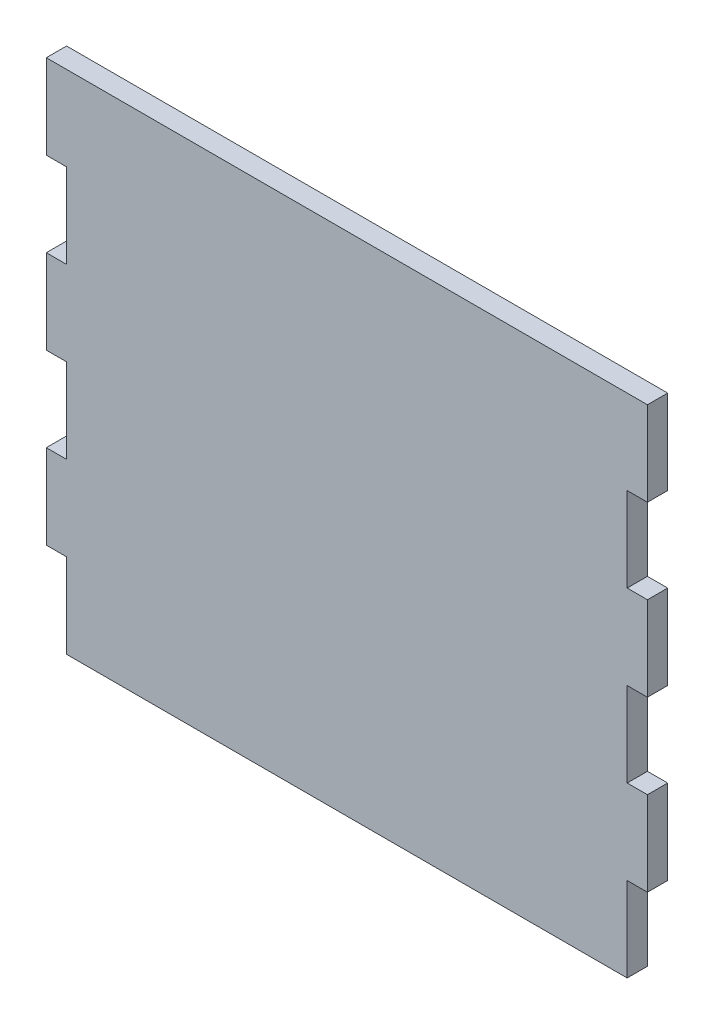
ISO-10303-21;
HEADER;
FILE_DESCRIPTION(('STEP AP214'),'2;1');
FILE_NAME('part.step','',(''),(''),'','','');
FILE_SCHEMA(('AUTOMOTIVE_DESIGN { 1 0 10303 214 1 1 1 1 }'));
ENDSEC;
DATA;
#1=APPLICATION_CONTEXT('core data for automotive mechanical design processes');
#2=APPLICATION_PROTOCOL_DEFINITION('international standard','automotive_design',2000,#1);
#3=PRODUCT_CONTEXT('',#1,'mechanical');
#4=PRODUCT('Part','Part','',(#3));
#5=PRODUCT_RELATED_PRODUCT_CATEGORY('part','',(#4));
#6=PRODUCT_DEFINITION_FORMATION('','',#4);
#7=PRODUCT_DEFINITION_CONTEXT('part definition',#1,'design');
#8=PRODUCT_DEFINITION('design','',#6,#7);
#9=PRODUCT_DEFINITION_SHAPE('','',#8);
#10=(LENGTH_UNIT() NAMED_UNIT(*) SI_UNIT(.MILLI.,.METRE.));
#11=(NAMED_UNIT(*) PLANE_ANGLE_UNIT() SI_UNIT($,.RADIAN.));
#12=(NAMED_UNIT(*) SI_UNIT($,.STERADIAN.) SOLID_ANGLE_UNIT());
#13=UNCERTAINTY_MEASURE_WITH_UNIT(LENGTH_MEASURE(1.E-05),#10,'distance_accuracy_value','');
#14=(GEOMETRIC_REPRESENTATION_CONTEXT(3) GLOBAL_UNCERTAINTY_ASSIGNED_CONTEXT((#13)) GLOBAL_UNIT_ASSIGNED_CONTEXT((#10,
#11,#12)) REPRESENTATION_CONTEXT('',''));
#15=CARTESIAN_POINT('',(0.,0.,0.));
#16=DIRECTION('',(0.,0.,1.));
#17=DIRECTION('',(1.,0.,0.));
#18=AXIS2_PLACEMENT_3D('',#15,#16,#17);
#19=CARTESIAN_POINT('',(0.,0.,6.));
#20=DIRECTION('',(-1.,0.,0.));
#21=DIRECTION('',(0.,0.,1.));
#22=AXIS2_PLACEMENT_3D('',#19,#20,#21);
#23=PLANE('',#22);
#24=DIRECTION('',(0.,1.,0.));
#25=VECTOR('',#24,1.);
#26=CARTESIAN_POINT('',(0.,0.,6.));
#27=LINE('',#26,#25);
#28=CARTESIAN_POINT('',(0.,125.,6.));
#29=VERTEX_POINT('',#28);
#30=CARTESIAN_POINT('',(0.,150.,6.));
#31=VERTEX_POINT('',#30);
#32=EDGE_CURVE('E409',#29,#31,#27,.T.);
#33=ORIENTED_EDGE('',*,*,#32,.F.);
#34=DIRECTION('',(0.,0.,1.));
#35=VECTOR('',#34,1.);
#36=CARTESIAN_POINT('',(0.,125.,0.));
#37=LINE('',#36,#35);
#38=CARTESIAN_POINT('',(0.,125.,0.));
#39=VERTEX_POINT('',#38);
#40=EDGE_CURVE('E251',#39,#29,#37,.T.);
#41=ORIENTED_EDGE('',*,*,#40,.F.);
#42=DIRECTION('',(0.,1.,0.));
#43=VECTOR('',#42,1.);
#44=CARTESIAN_POINT('',(0.,0.,0.));
#45=LINE('',#44,#43);
#46=CARTESIAN_POINT('',(0.,150.,0.));
#47=VERTEX_POINT('',#46);
#48=EDGE_CURVE('E400',#39,#47,#45,.T.);
#49=ORIENTED_EDGE('',*,*,#48,.T.);
#50=DIRECTION('',(0.,0.,-1.));
#51=VECTOR('',#50,1.);
#52=CARTESIAN_POINT('',(0.,150.,6.));
#53=LINE('',#52,#51);
#54=EDGE_CURVE('E11',#31,#47,#53,.T.);
#55=ORIENTED_EDGE('',*,*,#54,.F.);
#56=EDGE_LOOP('',(#33,#41,#49,#55));
#57=FACE_BOUND('',#56,.T.);
#58=ADVANCED_FACE('F45',(#57),#23,.F.);
#59=CARTESIAN_POINT('',(0.,75.,0.));
#60=VERTEX_POINT('',#59);
#61=CARTESIAN_POINT('',(0.,100.,0.));
#62=VERTEX_POINT('',#61);
#63=EDGE_CURVE('E430',#60,#62,#45,.T.);
#64=ORIENTED_EDGE('',*,*,#63,.T.);
#65=DIRECTION('',(0.,0.,1.));
#66=VECTOR('',#65,1.);
#67=CARTESIAN_POINT('',(0.,100.,0.));
#68=LINE('',#67,#66);
#69=CARTESIAN_POINT('',(0.,100.,6.));
#70=VERTEX_POINT('',#69);
#71=EDGE_CURVE('E218',#62,#70,#68,.T.);
#72=ORIENTED_EDGE('',*,*,#71,.T.);
#73=CARTESIAN_POINT('',(0.,75.,6.));
#74=VERTEX_POINT('',#73);
#75=EDGE_CURVE('E412',#74,#70,#27,.T.);
#76=ORIENTED_EDGE('',*,*,#75,.F.);
#77=DIRECTION('',(0.,0.,1.));
#78=VECTOR('',#77,1.);
#79=CARTESIAN_POINT('',(0.,75.,0.));
#80=LINE('',#79,#78);
#81=EDGE_CURVE('E317',#60,#74,#80,.T.);
#82=ORIENTED_EDGE('',*,*,#81,.F.);
#83=EDGE_LOOP('',(#64,#72,#76,#82));
#84=FACE_BOUND('',#83,.T.);
#85=ADVANCED_FACE('F472',(#84),#23,.F.);
#86=CARTESIAN_POINT('',(-178.,0.,6.));
#87=DIRECTION('',(1.,0.,0.));
#88=DIRECTION('',(0.,0.,-1.));
#89=AXIS2_PLACEMENT_3D('',#86,#87,#88);
#90=PLANE('',#89);
#91=DIRECTION('',(0.,-1.,0.));
#92=VECTOR('',#91,1.);
#93=CARTESIAN_POINT('',(-178.,0.,0.));
#94=LINE('',#93,#92);
#95=CARTESIAN_POINT('',(-178.,100.,0.));
#96=VERTEX_POINT('',#95);
#97=CARTESIAN_POINT('',(-178.,75.,0.));
#98=VERTEX_POINT('',#97);
#99=EDGE_CURVE('E440',#96,#98,#94,.T.);
#100=ORIENTED_EDGE('',*,*,#99,.T.);
#101=DIRECTION('',(0.,0.,1.));
#102=VECTOR('',#101,1.);
#103=CARTESIAN_POINT('',(-178.,75.,0.));
#104=LINE('',#103,#102);
#105=CARTESIAN_POINT('',(-178.,75.,6.));
#106=VERTEX_POINT('',#105);
#107=EDGE_CURVE('E244',#98,#106,#104,.T.);
#108=ORIENTED_EDGE('',*,*,#107,.T.);
#109=DIRECTION('',(0.,-1.,0.));
#110=VECTOR('',#109,1.);
#111=CARTESIAN_POINT('',(-178.,0.,6.));
#112=LINE('',#111,#110);
#113=CARTESIAN_POINT('',(-178.,100.,6.));
#114=VERTEX_POINT('',#113);
#115=EDGE_CURVE('E424',#114,#106,#112,.T.);
#116=ORIENTED_EDGE('',*,*,#115,.F.);
#117=DIRECTION('',(0.,0.,1.));
#118=VECTOR('',#117,1.);
#119=CARTESIAN_POINT('',(-178.,100.,0.));
#120=LINE('',#119,#118);
#121=EDGE_CURVE('E386',#96,#114,#120,.T.);
#122=ORIENTED_EDGE('',*,*,#121,.F.);
#123=EDGE_LOOP('',(#100,#108,#116,#122));
#124=FACE_BOUND('',#123,.T.);
#125=ADVANCED_FACE('F530',(#124),#90,.F.);
#126=CARTESIAN_POINT('',(-178.,150.,0.));
#127=VERTEX_POINT('',#126);
#128=CARTESIAN_POINT('',(-178.,125.,0.));
#129=VERTEX_POINT('',#128);
#130=EDGE_CURVE('E436',#127,#129,#94,.T.);
#131=ORIENTED_EDGE('',*,*,#130,.T.);
#132=DIRECTION('',(0.,0.,1.));
#133=VECTOR('',#132,1.);
#134=CARTESIAN_POINT('',(-178.,125.,0.));
#135=LINE('',#134,#133);
#136=CARTESIAN_POINT('',(-178.,125.,6.));
#137=VERTEX_POINT('',#136);
#138=EDGE_CURVE('E396',#129,#137,#135,.T.);
#139=ORIENTED_EDGE('',*,*,#138,.T.);
#140=CARTESIAN_POINT('',(-178.,150.,6.));
#141=VERTEX_POINT('',#140);
#142=EDGE_CURVE('E419',#141,#137,#112,.T.);
#143=ORIENTED_EDGE('',*,*,#142,.F.);
#144=DIRECTION('',(0.,0.,-1.));
#145=VECTOR('',#144,1.);
#146=CARTESIAN_POINT('',(-178.,150.,6.));
#147=LINE('',#146,#145);
#148=EDGE_CURVE('E54',#141,#127,#147,.T.);
#149=ORIENTED_EDGE('',*,*,#148,.T.);
#150=EDGE_LOOP('',(#131,#139,#143,#149));
#151=FACE_BOUND('',#150,.T.);
#152=ADVANCED_FACE('F449',(#151),#90,.F.);
#153=CARTESIAN_POINT('',(0.,25.,0.));
#154=VERTEX_POINT('',#153);
#155=CARTESIAN_POINT('',(0.,50.,0.));
#156=VERTEX_POINT('',#155);
#157=EDGE_CURVE('E431',#154,#156,#45,.T.);
#158=ORIENTED_EDGE('',*,*,#157,.T.);
#159=DIRECTION('',(0.,0.,1.));
#160=VECTOR('',#159,1.);
#161=CARTESIAN_POINT('',(0.,50.,0.));
#162=LINE('',#161,#160);
#163=CARTESIAN_POINT('',(0.,50.,6.));
#164=VERTEX_POINT('',#163);
#165=EDGE_CURVE('E320',#156,#164,#162,.T.);
#166=ORIENTED_EDGE('',*,*,#165,.T.);
#167=CARTESIAN_POINT('',(0.,25.,6.));
#168=VERTEX_POINT('',#167);
#169=EDGE_CURVE('E414',#168,#164,#27,.T.);
#170=ORIENTED_EDGE('',*,*,#169,.F.);
#171=DIRECTION('',(0.,0.,1.));
#172=VECTOR('',#171,1.);
#173=CARTESIAN_POINT('',(0.,25.,0.));
#174=LINE('',#173,#172);
#175=EDGE_CURVE('E367',#154,#168,#174,.T.);
#176=ORIENTED_EDGE('',*,*,#175,.F.);
#177=EDGE_LOOP('',(#158,#166,#170,#176));
#178=FACE_BOUND('',#177,.T.);
#179=ADVANCED_FACE('F47',(#178),#23,.F.);
#180=CARTESIAN_POINT('',(0.,150.,6.));
#181=DIRECTION('',(0.,-1.,0.));
#182=DIRECTION('',(0.,0.,-1.));
#183=AXIS2_PLACEMENT_3D('',#180,#181,#182);
#184=PLANE('',#183);
#185=DIRECTION('',(-1.,0.,0.));
#186=VECTOR('',#185,1.);
#187=CARTESIAN_POINT('',(0.,150.,0.));
#188=LINE('',#187,#186);
#189=EDGE_CURVE('E432',#47,#127,#188,.T.);
#190=ORIENTED_EDGE('',*,*,#189,.T.);
#191=ORIENTED_EDGE('',*,*,#148,.F.);
#192=DIRECTION('',(-1.,0.,0.));
#193=VECTOR('',#192,1.);
#194=CARTESIAN_POINT('',(0.,150.,6.));
#195=LINE('',#194,#193);
#196=EDGE_CURVE('E415',#31,#141,#195,.T.);
#197=ORIENTED_EDGE('',*,*,#196,.F.);
#198=ORIENTED_EDGE('',*,*,#54,.T.);
#199=EDGE_LOOP('',(#190,#191,#197,#198));
#200=FACE_BOUND('',#199,.T.);
#201=ADVANCED_FACE('F463',(#200),#184,.F.);
#202=CARTESIAN_POINT('',(-178.,50.,6.));
#203=VERTEX_POINT('',#202);
#204=CARTESIAN_POINT('',(-178.,25.,6.));
#205=VERTEX_POINT('',#204);
#206=EDGE_CURVE('E418',#203,#205,#112,.T.);
#207=ORIENTED_EDGE('',*,*,#206,.F.);
#208=DIRECTION('',(0.,0.,1.));
#209=VECTOR('',#208,1.);
#210=CARTESIAN_POINT('',(-178.,50.,0.));
#211=LINE('',#210,#209);
#212=CARTESIAN_POINT('',(-178.,50.,0.));
#213=VERTEX_POINT('',#212);
#214=EDGE_CURVE('E267',#213,#203,#211,.T.);
#215=ORIENTED_EDGE('',*,*,#214,.F.);
#216=CARTESIAN_POINT('',(-178.,25.,0.));
#217=VERTEX_POINT('',#216);
#218=EDGE_CURVE('E435',#213,#217,#94,.T.);
#219=ORIENTED_EDGE('',*,*,#218,.T.);
#220=DIRECTION('',(0.,0.,1.));
#221=VECTOR('',#220,1.);
#222=CARTESIAN_POINT('',(-178.,25.,0.));
#223=LINE('',#222,#221);
#224=EDGE_CURVE('E309',#217,#205,#223,.T.);
#225=ORIENTED_EDGE('',*,*,#224,.T.);
#226=EDGE_LOOP('',(#207,#215,#219,#225));
#227=FACE_BOUND('',#226,.T.);
#228=ADVANCED_FACE('F500',(#227),#90,.F.);
#229=CARTESIAN_POINT('',(0.,0.,6.));
#230=DIRECTION('',(0.,1.,0.));
#231=DIRECTION('',(-1.,0.,0.));
#232=AXIS2_PLACEMENT_3D('',#229,#230,#231);
#233=PLANE('',#232);
#234=DIRECTION('',(1.,0.,0.));
#235=VECTOR('',#234,1.);
#236=CARTESIAN_POINT('',(0.,0.,6.));
#237=LINE('',#236,#235);
#238=CARTESIAN_POINT('',(-172.,0.,6.));
#239=VERTEX_POINT('',#238);
#240=CARTESIAN_POINT('',(-6.00000000000001,0.,6.));
#241=VERTEX_POINT('',#240);
#242=EDGE_CURVE('E423',#239,#241,#237,.T.);
#243=ORIENTED_EDGE('',*,*,#242,.F.);
#244=DIRECTION('',(0.,0.,1.));
#245=VECTOR('',#244,1.);
#246=CARTESIAN_POINT('',(-172.,0.,0.));
#247=LINE('',#246,#245);
#248=CARTESIAN_POINT('',(-172.,0.,0.));
#249=VERTEX_POINT('',#248);
#250=EDGE_CURVE('E333',#249,#239,#247,.T.);
#251=ORIENTED_EDGE('',*,*,#250,.F.);
#252=DIRECTION('',(1.,0.,0.));
#253=VECTOR('',#252,1.);
#254=CARTESIAN_POINT('',(0.,0.,0.));
#255=LINE('',#254,#253);
#256=CARTESIAN_POINT('',(-6.00000000000001,0.,0.));
#257=VERTEX_POINT('',#256);
#258=EDGE_CURVE('E413',#249,#257,#255,.T.);
#259=ORIENTED_EDGE('',*,*,#258,.T.);
#260=DIRECTION('',(0.,0.,1.));
#261=VECTOR('',#260,1.);
#262=CARTESIAN_POINT('',(-6.00000000000001,0.,0.));
#263=LINE('',#262,#261);
#264=EDGE_CURVE('E358',#257,#241,#263,.T.);
#265=ORIENTED_EDGE('',*,*,#264,.T.);
#266=EDGE_LOOP('',(#243,#251,#259,#265));
#267=FACE_BOUND('',#266,.T.);
#268=ADVANCED_FACE('F509',(#267),#233,.F.);
#269=CARTESIAN_POINT('',(0.,0.,6.));
#270=DIRECTION('',(0.,0.,1.));
#271=DIRECTION('',(1.,0.,0.));
#272=AXIS2_PLACEMENT_3D('',#269,#270,#271);
#273=PLANE('',#272);
#274=DIRECTION('',(-1.,0.,0.));
#275=VECTOR('',#274,1.);
#276=CARTESIAN_POINT('',(-6.00000000000001,125.,6.));
#277=LINE('',#276,#275);
#278=CARTESIAN_POINT('',(-6.00000000000001,125.,6.));
#279=VERTEX_POINT('',#278);
#280=EDGE_CURVE('E233',#29,#279,#277,.T.);
#281=ORIENTED_EDGE('',*,*,#280,.F.);
#282=ORIENTED_EDGE('',*,*,#32,.T.);
#283=ORIENTED_EDGE('',*,*,#196,.T.);
#284=ORIENTED_EDGE('',*,*,#142,.T.);
#285=DIRECTION('',(-1.,0.,0.));
#286=VECTOR('',#285,1.);
#287=CARTESIAN_POINT('',(-178.,125.,6.));
#288=LINE('',#287,#286);
#289=CARTESIAN_POINT('',(-172.,125.,6.));
#290=VERTEX_POINT('',#289);
#291=EDGE_CURVE('E378',#290,#137,#288,.T.);
#292=ORIENTED_EDGE('',*,*,#291,.F.);
#293=DIRECTION('',(0.,1.,0.));
#294=VECTOR('',#293,1.);
#295=CARTESIAN_POINT('',(-172.,125.,6.));
#296=LINE('',#295,#294);
#297=CARTESIAN_POINT('',(-172.,100.,6.));
#298=VERTEX_POINT('',#297);
#299=EDGE_CURVE('E390',#298,#290,#296,.T.);
#300=ORIENTED_EDGE('',*,*,#299,.F.);
#301=DIRECTION('',(1.,0.,0.));
#302=VECTOR('',#301,1.);
#303=CARTESIAN_POINT('',(-178.,100.,6.));
#304=LINE('',#303,#302);
#305=EDGE_CURVE('E250',#114,#298,#304,.T.);
#306=ORIENTED_EDGE('',*,*,#305,.F.);
#307=ORIENTED_EDGE('',*,*,#115,.T.);
#308=DIRECTION('',(-1.,0.,0.));
#309=VECTOR('',#308,1.);
#310=CARTESIAN_POINT('',(-178.,75.,6.));
#311=LINE('',#310,#309);
#312=CARTESIAN_POINT('',(-172.,75.,6.));
#313=VERTEX_POINT('',#312);
#314=EDGE_CURVE('E260',#313,#106,#311,.T.);
#315=ORIENTED_EDGE('',*,*,#314,.F.);
#316=DIRECTION('',(0.,1.,0.));
#317=VECTOR('',#316,1.);
#318=CARTESIAN_POINT('',(-172.,75.,6.));
#319=LINE('',#318,#317);
#320=CARTESIAN_POINT('',(-172.,50.,6.));
#321=VERTEX_POINT('',#320);
#322=EDGE_CURVE('E272',#321,#313,#319,.T.);
#323=ORIENTED_EDGE('',*,*,#322,.F.);
#324=DIRECTION('',(1.,0.,0.));
#325=VECTOR('',#324,1.);
#326=CARTESIAN_POINT('',(-178.,50.,6.));
#327=LINE('',#326,#325);
#328=EDGE_CURVE('E268',#203,#321,#327,.T.);
#329=ORIENTED_EDGE('',*,*,#328,.F.);
#330=ORIENTED_EDGE('',*,*,#206,.T.);
#331=DIRECTION('',(-1.,0.,0.));
#332=VECTOR('',#331,1.);
#333=CARTESIAN_POINT('',(-178.,25.,6.));
#334=LINE('',#333,#332);
#335=CARTESIAN_POINT('',(-172.,25.,6.));
#336=VERTEX_POINT('',#335);
#337=EDGE_CURVE('E330',#336,#205,#334,.T.);
#338=ORIENTED_EDGE('',*,*,#337,.F.);
#339=DIRECTION('',(0.,1.,0.));
#340=VECTOR('',#339,1.);
#341=CARTESIAN_POINT('',(-172.,25.,6.));
#342=LINE('',#341,#340);
#343=EDGE_CURVE('E334',#239,#336,#342,.T.);
#344=ORIENTED_EDGE('',*,*,#343,.F.);
#345=ORIENTED_EDGE('',*,*,#242,.T.);
#346=DIRECTION('',(0.,-1.,0.));
#347=VECTOR('',#346,1.);
#348=CARTESIAN_POINT('',(-6.00000000000001,25.,6.));
#349=LINE('',#348,#347);
#350=CARTESIAN_POINT('',(-6.00000000000001,25.,6.));
#351=VERTEX_POINT('',#350);
#352=EDGE_CURVE('E359',#351,#241,#349,.T.);
#353=ORIENTED_EDGE('',*,*,#352,.F.);
#354=DIRECTION('',(-1.,0.,0.));
#355=VECTOR('',#354,1.);
#356=CARTESIAN_POINT('',(-6.00000000000001,25.,6.));
#357=LINE('',#356,#355);
#358=EDGE_CURVE('E354',#168,#351,#357,.T.);
#359=ORIENTED_EDGE('',*,*,#358,.F.);
#360=ORIENTED_EDGE('',*,*,#169,.T.);
#361=DIRECTION('',(1.,0.,0.));
#362=VECTOR('',#361,1.);
#363=CARTESIAN_POINT('',(-6.00000000000001,50.,6.));
#364=LINE('',#363,#362);
#365=CARTESIAN_POINT('',(-6.00000000000001,50.,6.));
#366=VERTEX_POINT('',#365);
#367=EDGE_CURVE('E308',#366,#164,#364,.T.);
#368=ORIENTED_EDGE('',*,*,#367,.F.);
#369=DIRECTION('',(0.,-1.,0.));
#370=VECTOR('',#369,1.);
#371=CARTESIAN_POINT('',(-6.00000000000001,75.,6.));
#372=LINE('',#371,#370);
#373=CARTESIAN_POINT('',(-6.00000000000001,75.,6.));
#374=VERTEX_POINT('',#373);
#375=EDGE_CURVE('E304',#374,#366,#372,.T.);
#376=ORIENTED_EDGE('',*,*,#375,.F.);
#377=DIRECTION('',(-1.,0.,0.));
#378=VECTOR('',#377,1.);
#379=CARTESIAN_POINT('',(-6.00000000000001,75.,6.));
#380=LINE('',#379,#378);
#381=EDGE_CURVE('E295',#74,#374,#380,.T.);
#382=ORIENTED_EDGE('',*,*,#381,.F.);
#383=ORIENTED_EDGE('',*,*,#75,.T.);
#384=DIRECTION('',(1.,0.,0.));
#385=VECTOR('',#384,1.);
#386=CARTESIAN_POINT('',(-6.00000000000001,100.,6.));
#387=LINE('',#386,#385);
#388=CARTESIAN_POINT('',(-6.00000000000001,100.,6.));
#389=VERTEX_POINT('',#388);
#390=EDGE_CURVE('E237',#389,#70,#387,.T.);
#391=ORIENTED_EDGE('',*,*,#390,.F.);
#392=DIRECTION('',(0.,-1.,0.));
#393=VECTOR('',#392,1.);
#394=CARTESIAN_POINT('',(-6.00000000000001,125.,6.));
#395=LINE('',#394,#393);
#396=EDGE_CURVE('E214',#279,#389,#395,.T.);
#397=ORIENTED_EDGE('',*,*,#396,.F.);
#398=EDGE_LOOP('',(#281,#282,#283,#284,#292,#300,#306,#307,#315,#323,#329,#330,#338,#344,#345,
#353,#359,#360,#368,#376,#382,#383,#391,#397));
#399=FACE_BOUND('',#398,.T.);
#400=ADVANCED_FACE('F459',(#399),#273,.T.);
#401=CARTESIAN_POINT('',(0.,0.,0.));
#402=DIRECTION('',(0.,0.,1.));
#403=DIRECTION('',(1.,0.,0.));
#404=AXIS2_PLACEMENT_3D('',#401,#402,#403);
#405=PLANE('',#404);
#406=ORIENTED_EDGE('',*,*,#48,.F.);
#407=DIRECTION('',(-1.,0.,0.));
#408=VECTOR('',#407,1.);
#409=CARTESIAN_POINT('',(-6.00000000000001,125.,0.));
#410=LINE('',#409,#408);
#411=CARTESIAN_POINT('',(-6.00000000000001,125.,0.));
#412=VERTEX_POINT('',#411);
#413=EDGE_CURVE('E219',#39,#412,#410,.T.);
#414=ORIENTED_EDGE('',*,*,#413,.T.);
#415=DIRECTION('',(0.,-1.,0.));
#416=VECTOR('',#415,1.);
#417=CARTESIAN_POINT('',(-6.00000000000001,125.,0.));
#418=LINE('',#417,#416);
#419=CARTESIAN_POINT('',(-6.00000000000001,100.,0.));
#420=VERTEX_POINT('',#419);
#421=EDGE_CURVE('E211',#412,#420,#418,.T.);
#422=ORIENTED_EDGE('',*,*,#421,.T.);
#423=DIRECTION('',(1.,0.,0.));
#424=VECTOR('',#423,1.);
#425=CARTESIAN_POINT('',(-6.00000000000001,100.,0.));
#426=LINE('',#425,#424);
#427=EDGE_CURVE('E222',#420,#62,#426,.T.);
#428=ORIENTED_EDGE('',*,*,#427,.T.);
#429=ORIENTED_EDGE('',*,*,#63,.F.);
#430=DIRECTION('',(-1.,0.,0.));
#431=VECTOR('',#430,1.);
#432=CARTESIAN_POINT('',(-6.00000000000001,75.,0.));
#433=LINE('',#432,#431);
#434=CARTESIAN_POINT('',(-6.00000000000001,75.,0.));
#435=VERTEX_POINT('',#434);
#436=EDGE_CURVE('E299',#60,#435,#433,.T.);
#437=ORIENTED_EDGE('',*,*,#436,.T.);
#438=DIRECTION('',(0.,-1.,0.));
#439=VECTOR('',#438,1.);
#440=CARTESIAN_POINT('',(-6.00000000000001,75.,0.));
#441=LINE('',#440,#439);
#442=CARTESIAN_POINT('',(-6.00000000000001,50.,0.));
#443=VERTEX_POINT('',#442);
#444=EDGE_CURVE('E290',#435,#443,#441,.T.);
#445=ORIENTED_EDGE('',*,*,#444,.T.);
#446=DIRECTION('',(1.,0.,0.));
#447=VECTOR('',#446,1.);
#448=CARTESIAN_POINT('',(-6.00000000000001,50.,0.));
#449=LINE('',#448,#447);
#450=EDGE_CURVE('E294',#443,#156,#449,.T.);
#451=ORIENTED_EDGE('',*,*,#450,.T.);
#452=ORIENTED_EDGE('',*,*,#157,.F.);
#453=DIRECTION('',(-1.,0.,0.));
#454=VECTOR('',#453,1.);
#455=CARTESIAN_POINT('',(-6.00000000000001,25.,0.));
#456=LINE('',#455,#454);
#457=CARTESIAN_POINT('',(-6.00000000000001,25.,0.));
#458=VERTEX_POINT('',#457);
#459=EDGE_CURVE('E353',#154,#458,#456,.T.);
#460=ORIENTED_EDGE('',*,*,#459,.T.);
#461=DIRECTION('',(0.,-1.,0.));
#462=VECTOR('',#461,1.);
#463=CARTESIAN_POINT('',(-6.00000000000001,25.,0.));
#464=LINE('',#463,#462);
#465=EDGE_CURVE('E349',#458,#257,#464,.T.);
#466=ORIENTED_EDGE('',*,*,#465,.T.);
#467=ORIENTED_EDGE('',*,*,#258,.F.);
#468=DIRECTION('',(0.,1.,0.));
#469=VECTOR('',#468,1.);
#470=CARTESIAN_POINT('',(-172.,25.,0.));
#471=LINE('',#470,#469);
#472=CARTESIAN_POINT('',(-172.,25.,0.));
#473=VERTEX_POINT('',#472);
#474=EDGE_CURVE('E326',#249,#473,#471,.T.);
#475=ORIENTED_EDGE('',*,*,#474,.T.);
#476=DIRECTION('',(-1.,0.,0.));
#477=VECTOR('',#476,1.);
#478=CARTESIAN_POINT('',(-178.,25.,0.));
#479=LINE('',#478,#477);
#480=EDGE_CURVE('E69',#473,#217,#479,.T.);
#481=ORIENTED_EDGE('',*,*,#480,.T.);
#482=ORIENTED_EDGE('',*,*,#218,.F.);
#483=DIRECTION('',(1.,0.,0.));
#484=VECTOR('',#483,1.);
#485=CARTESIAN_POINT('',(-178.,50.,0.));
#486=LINE('',#485,#484);
#487=CARTESIAN_POINT('',(-172.,50.,0.));
#488=VERTEX_POINT('',#487);
#489=EDGE_CURVE('E256',#213,#488,#486,.T.);
#490=ORIENTED_EDGE('',*,*,#489,.T.);
#491=DIRECTION('',(0.,1.,0.));
#492=VECTOR('',#491,1.);
#493=CARTESIAN_POINT('',(-172.,75.,0.));
#494=LINE('',#493,#492);
#495=CARTESIAN_POINT('',(-172.,75.,0.));
#496=VERTEX_POINT('',#495);
#497=EDGE_CURVE('E61',#488,#496,#494,.T.);
#498=ORIENTED_EDGE('',*,*,#497,.T.);
#499=DIRECTION('',(-1.,0.,0.));
#500=VECTOR('',#499,1.);
#501=CARTESIAN_POINT('',(-178.,75.,0.));
#502=LINE('',#501,#500);
#503=EDGE_CURVE('E263',#496,#98,#502,.T.);
#504=ORIENTED_EDGE('',*,*,#503,.T.);
#505=ORIENTED_EDGE('',*,*,#99,.F.);
#506=DIRECTION('',(1.,0.,0.));
#507=VECTOR('',#506,1.);
#508=CARTESIAN_POINT('',(-178.,100.,0.));
#509=LINE('',#508,#507);
#510=CARTESIAN_POINT('',(-172.,100.,0.));
#511=VERTEX_POINT('',#510);
#512=EDGE_CURVE('E373',#96,#511,#509,.T.);
#513=ORIENTED_EDGE('',*,*,#512,.T.);
#514=DIRECTION('',(0.,1.,0.));
#515=VECTOR('',#514,1.);
#516=CARTESIAN_POINT('',(-172.,125.,0.));
#517=LINE('',#516,#515);
#518=CARTESIAN_POINT('',(-172.,125.,0.));
#519=VERTEX_POINT('',#518);
#520=EDGE_CURVE('E377',#511,#519,#517,.T.);
#521=ORIENTED_EDGE('',*,*,#520,.T.);
#522=DIRECTION('',(-1.,0.,0.));
#523=VECTOR('',#522,1.);
#524=CARTESIAN_POINT('',(-178.,125.,0.));
#525=LINE('',#524,#523);
#526=EDGE_CURVE('E382',#519,#129,#525,.T.);
#527=ORIENTED_EDGE('',*,*,#526,.T.);
#528=ORIENTED_EDGE('',*,*,#130,.F.);
#529=ORIENTED_EDGE('',*,*,#189,.F.);
#530=EDGE_LOOP('',(#406,#414,#422,#428,#429,#437,#445,#451,#452,#460,#466,#467,#475,#481,#482,
#490,#498,#504,#505,#513,#521,#527,#528,#529));
#531=FACE_BOUND('',#530,.T.);
#532=ADVANCED_FACE('F231',(#531),#405,.F.);
#533=CARTESIAN_POINT('',(-178.,125.,0.));
#534=DIRECTION('',(0.,1.,0.));
#535=DIRECTION('',(0.,0.,1.));
#536=AXIS2_PLACEMENT_3D('',#533,#534,#535);
#537=PLANE('',#536);
#538=ORIENTED_EDGE('',*,*,#291,.T.);
#539=ORIENTED_EDGE('',*,*,#138,.F.);
#540=ORIENTED_EDGE('',*,*,#526,.F.);
#541=DIRECTION('',(0.,0.,1.));
#542=VECTOR('',#541,1.);
#543=CARTESIAN_POINT('',(-172.,125.,0.));
#544=LINE('',#543,#542);
#545=EDGE_CURVE('E401',#519,#290,#544,.T.);
#546=ORIENTED_EDGE('',*,*,#545,.T.);
#547=EDGE_LOOP('',(#538,#539,#540,#546));
#548=FACE_BOUND('',#547,.T.);
#549=ADVANCED_FACE('F455',(#548),#537,.F.);
#550=CARTESIAN_POINT('',(-172.,125.,0.));
#551=DIRECTION('',(1.,0.,0.));
#552=DIRECTION('',(0.,0.,-1.));
#553=AXIS2_PLACEMENT_3D('',#550,#551,#552);
#554=PLANE('',#553);
#555=ORIENTED_EDGE('',*,*,#299,.T.);
#556=ORIENTED_EDGE('',*,*,#545,.F.);
#557=ORIENTED_EDGE('',*,*,#520,.F.);
#558=DIRECTION('',(0.,0.,1.));
#559=VECTOR('',#558,1.);
#560=CARTESIAN_POINT('',(-172.,100.,0.));
#561=LINE('',#560,#559);
#562=EDGE_CURVE('E404',#511,#298,#561,.T.);
#563=ORIENTED_EDGE('',*,*,#562,.T.);
#564=EDGE_LOOP('',(#555,#556,#557,#563));
#565=FACE_BOUND('',#564,.T.);
#566=ADVANCED_FACE('F556',(#565),#554,.F.);
#567=CARTESIAN_POINT('',(-178.,100.,0.));
#568=DIRECTION('',(0.,-1.,0.));
#569=DIRECTION('',(0.,0.,-1.));
#570=AXIS2_PLACEMENT_3D('',#567,#568,#569);
#571=PLANE('',#570);
#572=ORIENTED_EDGE('',*,*,#305,.T.);
#573=ORIENTED_EDGE('',*,*,#562,.F.);
#574=ORIENTED_EDGE('',*,*,#512,.F.);
#575=ORIENTED_EDGE('',*,*,#121,.T.);
#576=EDGE_LOOP('',(#572,#573,#574,#575));
#577=FACE_BOUND('',#576,.T.);
#578=ADVANCED_FACE('F553',(#577),#571,.F.);
#579=CARTESIAN_POINT('',(-6.00000000000001,25.,0.));
#580=DIRECTION('',(-1.,0.,0.));
#581=DIRECTION('',(0.,0.,1.));
#582=AXIS2_PLACEMENT_3D('',#579,#580,#581);
#583=PLANE('',#582);
#584=ORIENTED_EDGE('',*,*,#352,.T.);
#585=ORIENTED_EDGE('',*,*,#264,.F.);
#586=ORIENTED_EDGE('',*,*,#465,.F.);
#587=DIRECTION('',(0.,0.,1.));
#588=VECTOR('',#587,1.);
#589=CARTESIAN_POINT('',(-6.00000000000001,25.,0.));
#590=LINE('',#589,#588);
#591=EDGE_CURVE('E338',#458,#351,#590,.T.);
#592=ORIENTED_EDGE('',*,*,#591,.T.);
#593=EDGE_LOOP('',(#584,#585,#586,#592));
#594=FACE_BOUND('',#593,.T.);
#595=ADVANCED_FACE('F522',(#594),#583,.F.);
#596=CARTESIAN_POINT('',(-6.00000000000001,25.,0.));
#597=DIRECTION('',(0.,1.,0.));
#598=DIRECTION('',(0.,0.,1.));
#599=AXIS2_PLACEMENT_3D('',#596,#597,#598);
#600=PLANE('',#599);
#601=ORIENTED_EDGE('',*,*,#358,.T.);
#602=ORIENTED_EDGE('',*,*,#591,.F.);
#603=ORIENTED_EDGE('',*,*,#459,.F.);
#604=ORIENTED_EDGE('',*,*,#175,.T.);
#605=EDGE_LOOP('',(#601,#602,#603,#604));
#606=FACE_BOUND('',#605,.T.);
#607=ADVANCED_FACE('F514',(#606),#600,.F.);
#608=CARTESIAN_POINT('',(-178.,25.,0.));
#609=DIRECTION('',(0.,1.,0.));
#610=DIRECTION('',(0.,0.,1.));
#611=AXIS2_PLACEMENT_3D('',#608,#609,#610);
#612=PLANE('',#611);
#613=ORIENTED_EDGE('',*,*,#337,.T.);
#614=ORIENTED_EDGE('',*,*,#224,.F.);
#615=ORIENTED_EDGE('',*,*,#480,.F.);
#616=DIRECTION('',(0.,0.,1.));
#617=VECTOR('',#616,1.);
#618=CARTESIAN_POINT('',(-172.,25.,0.));
#619=LINE('',#618,#617);
#620=EDGE_CURVE('E344',#473,#336,#619,.T.);
#621=ORIENTED_EDGE('',*,*,#620,.T.);
#622=EDGE_LOOP('',(#613,#614,#615,#621));
#623=FACE_BOUND('',#622,.T.);
#624=ADVANCED_FACE('F512',(#623),#612,.F.);
#625=CARTESIAN_POINT('',(-172.,25.,0.));
#626=DIRECTION('',(1.,0.,0.));
#627=DIRECTION('',(0.,0.,-1.));
#628=AXIS2_PLACEMENT_3D('',#625,#626,#627);
#629=PLANE('',#628);
#630=ORIENTED_EDGE('',*,*,#343,.T.);
#631=ORIENTED_EDGE('',*,*,#620,.F.);
#632=ORIENTED_EDGE('',*,*,#474,.F.);
#633=ORIENTED_EDGE('',*,*,#250,.T.);
#634=EDGE_LOOP('',(#630,#631,#632,#633));
#635=FACE_BOUND('',#634,.T.);
#636=ADVANCED_FACE('F505',(#635),#629,.F.);
#637=CARTESIAN_POINT('',(-6.00000000000001,75.,0.));
#638=DIRECTION('',(-1.,0.,0.));
#639=DIRECTION('',(0.,0.,1.));
#640=AXIS2_PLACEMENT_3D('',#637,#638,#639);
#641=PLANE('',#640);
#642=ORIENTED_EDGE('',*,*,#375,.T.);
#643=DIRECTION('',(0.,0.,1.));
#644=VECTOR('',#643,1.);
#645=CARTESIAN_POINT('',(-6.00000000000001,50.,0.));
#646=LINE('',#645,#644);
#647=EDGE_CURVE('E303',#443,#366,#646,.T.);
#648=ORIENTED_EDGE('',*,*,#647,.F.);
#649=ORIENTED_EDGE('',*,*,#444,.F.);
#650=DIRECTION('',(0.,0.,1.));
#651=VECTOR('',#650,1.);
#652=CARTESIAN_POINT('',(-6.00000000000001,75.,0.));
#653=LINE('',#652,#651);
#654=EDGE_CURVE('E273',#435,#374,#653,.T.);
#655=ORIENTED_EDGE('',*,*,#654,.T.);
#656=EDGE_LOOP('',(#642,#648,#649,#655));
#657=FACE_BOUND('',#656,.T.);
#658=ADVANCED_FACE('F520',(#657),#641,.F.);
#659=CARTESIAN_POINT('',(-6.00000000000001,75.,0.));
#660=DIRECTION('',(0.,1.,0.));
#661=DIRECTION('',(0.,0.,1.));
#662=AXIS2_PLACEMENT_3D('',#659,#660,#661);
#663=PLANE('',#662);
#664=ORIENTED_EDGE('',*,*,#381,.T.);
#665=ORIENTED_EDGE('',*,*,#654,.F.);
#666=ORIENTED_EDGE('',*,*,#436,.F.);
#667=ORIENTED_EDGE('',*,*,#81,.T.);
#668=EDGE_LOOP('',(#664,#665,#666,#667));
#669=FACE_BOUND('',#668,.T.);
#670=ADVANCED_FACE('F597',(#669),#663,.F.);
#671=CARTESIAN_POINT('',(-6.00000000000001,50.,0.));
#672=DIRECTION('',(0.,-1.,0.));
#673=DIRECTION('',(0.,0.,-1.));
#674=AXIS2_PLACEMENT_3D('',#671,#672,#673);
#675=PLANE('',#674);
#676=ORIENTED_EDGE('',*,*,#367,.T.);
#677=ORIENTED_EDGE('',*,*,#165,.F.);
#678=ORIENTED_EDGE('',*,*,#450,.F.);
#679=ORIENTED_EDGE('',*,*,#647,.T.);
#680=EDGE_LOOP('',(#676,#677,#678,#679));
#681=FACE_BOUND('',#680,.T.);
#682=ADVANCED_FACE('F485',(#681),#675,.F.);
#683=CARTESIAN_POINT('',(-178.,75.,0.));
#684=DIRECTION('',(0.,1.,0.));
#685=DIRECTION('',(0.,0.,1.));
#686=AXIS2_PLACEMENT_3D('',#683,#684,#685);
#687=PLANE('',#686);
#688=ORIENTED_EDGE('',*,*,#314,.T.);
#689=ORIENTED_EDGE('',*,*,#107,.F.);
#690=ORIENTED_EDGE('',*,*,#503,.F.);
#691=DIRECTION('',(0.,0.,1.));
#692=VECTOR('',#691,1.);
#693=CARTESIAN_POINT('',(-172.,75.,0.));
#694=LINE('',#693,#692);
#695=EDGE_CURVE('E282',#496,#313,#694,.T.);
#696=ORIENTED_EDGE('',*,*,#695,.T.);
#697=EDGE_LOOP('',(#688,#689,#690,#696));
#698=FACE_BOUND('',#697,.T.);
#699=ADVANCED_FACE('F617',(#698),#687,.F.);
#700=CARTESIAN_POINT('',(-172.,75.,0.));
#701=DIRECTION('',(1.,0.,0.));
#702=DIRECTION('',(0.,0.,-1.));
#703=AXIS2_PLACEMENT_3D('',#700,#701,#702);
#704=PLANE('',#703);
#705=ORIENTED_EDGE('',*,*,#322,.T.);
#706=ORIENTED_EDGE('',*,*,#695,.F.);
#707=ORIENTED_EDGE('',*,*,#497,.F.);
#708=DIRECTION('',(0.,0.,1.));
#709=VECTOR('',#708,1.);
#710=CARTESIAN_POINT('',(-172.,50.,0.));
#711=LINE('',#710,#709);
#712=EDGE_CURVE('E285',#488,#321,#711,.T.);
#713=ORIENTED_EDGE('',*,*,#712,.T.);
#714=EDGE_LOOP('',(#705,#706,#707,#713));
#715=FACE_BOUND('',#714,.T.);
#716=ADVANCED_FACE('F627',(#715),#704,.F.);
#717=CARTESIAN_POINT('',(-178.,50.,0.));
#718=DIRECTION('',(0.,-1.,0.));
#719=DIRECTION('',(0.,0.,-1.));
#720=AXIS2_PLACEMENT_3D('',#717,#718,#719);
#721=PLANE('',#720);
#722=ORIENTED_EDGE('',*,*,#328,.T.);
#723=ORIENTED_EDGE('',*,*,#712,.F.);
#724=ORIENTED_EDGE('',*,*,#489,.F.);
#725=ORIENTED_EDGE('',*,*,#214,.T.);
#726=EDGE_LOOP('',(#722,#723,#724,#725));
#727=FACE_BOUND('',#726,.T.);
#728=ADVANCED_FACE('F638',(#727),#721,.F.);
#729=CARTESIAN_POINT('',(-6.00000000000001,125.,0.));
#730=DIRECTION('',(-1.,0.,0.));
#731=DIRECTION('',(0.,0.,1.));
#732=AXIS2_PLACEMENT_3D('',#729,#730,#731);
#733=PLANE('',#732);
#734=ORIENTED_EDGE('',*,*,#396,.T.);
#735=DIRECTION('',(0.,0.,1.));
#736=VECTOR('',#735,1.);
#737=CARTESIAN_POINT('',(-6.00000000000001,100.,0.));
#738=LINE('',#737,#736);
#739=EDGE_CURVE('E207',#420,#389,#738,.T.);
#740=ORIENTED_EDGE('',*,*,#739,.F.);
#741=ORIENTED_EDGE('',*,*,#421,.F.);
#742=DIRECTION('',(0.,0.,1.));
#743=VECTOR('',#742,1.);
#744=CARTESIAN_POINT('',(-6.00000000000001,125.,0.));
#745=LINE('',#744,#743);
#746=EDGE_CURVE('E247',#412,#279,#745,.T.);
#747=ORIENTED_EDGE('',*,*,#746,.T.);
#748=EDGE_LOOP('',(#734,#740,#741,#747));
#749=FACE_BOUND('',#748,.T.);
#750=ADVANCED_FACE('F209',(#749),#733,.F.);
#751=CARTESIAN_POINT('',(-6.00000000000001,125.,0.));
#752=DIRECTION('',(0.,1.,0.));
#753=DIRECTION('',(0.,0.,1.));
#754=AXIS2_PLACEMENT_3D('',#751,#752,#753);
#755=PLANE('',#754);
#756=ORIENTED_EDGE('',*,*,#280,.T.);
#757=ORIENTED_EDGE('',*,*,#746,.F.);
#758=ORIENTED_EDGE('',*,*,#413,.F.);
#759=ORIENTED_EDGE('',*,*,#40,.T.);
#760=EDGE_LOOP('',(#756,#757,#758,#759));
#761=FACE_BOUND('',#760,.T.);
#762=ADVANCED_FACE('F467',(#761),#755,.F.);
#763=CARTESIAN_POINT('',(-6.00000000000001,100.,0.));
#764=DIRECTION('',(0.,-1.,0.));
#765=DIRECTION('',(0.,0.,-1.));
#766=AXIS2_PLACEMENT_3D('',#763,#764,#765);
#767=PLANE('',#766);
#768=ORIENTED_EDGE('',*,*,#390,.T.);
#769=ORIENTED_EDGE('',*,*,#71,.F.);
#770=ORIENTED_EDGE('',*,*,#427,.F.);
#771=ORIENTED_EDGE('',*,*,#739,.T.);
#772=EDGE_LOOP('',(#768,#769,#770,#771));
#773=FACE_BOUND('',#772,.T.);
#774=ADVANCED_FACE('F223',(#773),#767,.F.);
#775=CLOSED_SHELL('',(#58,#85,#125,#152,#179,#201,#228,#268,#400,#532,#549,#566,#578,#595,#607,
#624,#636,#658,#670,#682,#699,#716,#728,#750,#762,#774));
#776=MANIFOLD_SOLID_BREP('B2',#775);
#777=ADVANCED_BREP_SHAPE_REPRESENTATION('',(#18,#776),#14);
#778=SHAPE_DEFINITION_REPRESENTATION(#9,#777);
ENDSEC;
END-ISO-10303-21;
